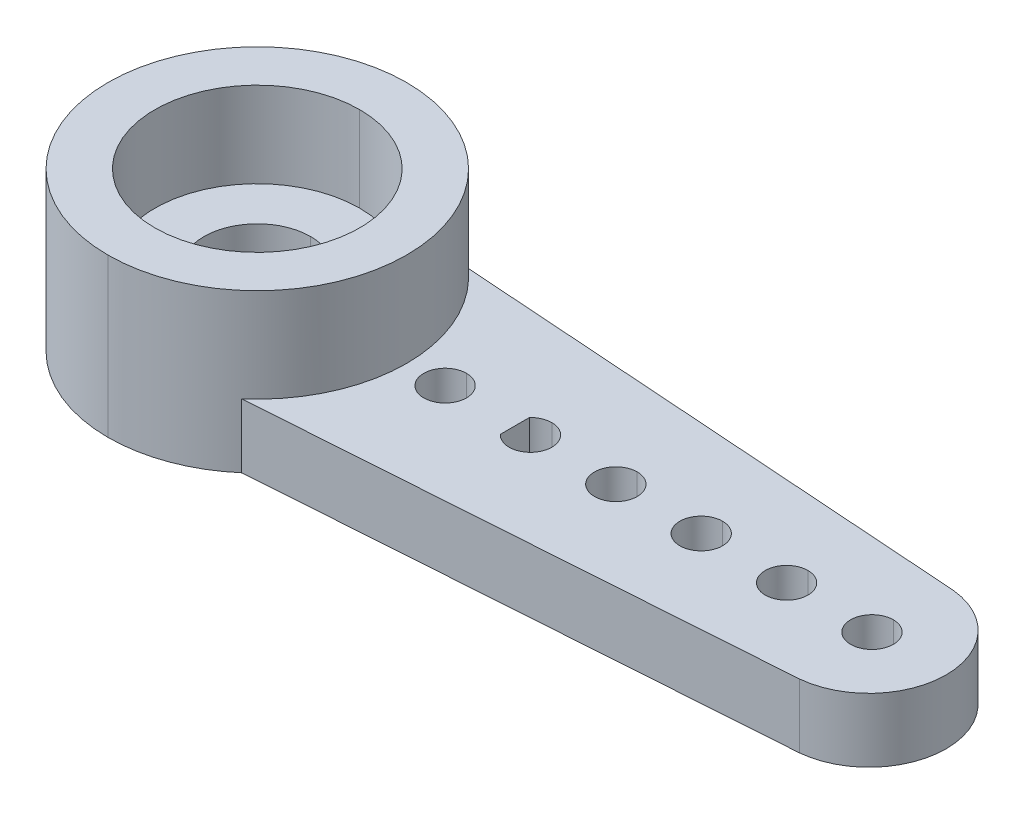
ISO-10303-21;
HEADER;
FILE_DESCRIPTION(('STEP AP214'),'2;1');
FILE_NAME('part.step','',(''),(''),'','','');
FILE_SCHEMA(('AUTOMOTIVE_DESIGN { 1 0 10303 214 1 1 1 1 }'));
ENDSEC;
DATA;
#1=APPLICATION_CONTEXT('core data for automotive mechanical design processes');
#2=APPLICATION_PROTOCOL_DEFINITION('international standard','automotive_design',2000,#1);
#3=PRODUCT_CONTEXT('',#1,'mechanical');
#4=PRODUCT('Part','Part','',(#3));
#5=PRODUCT_RELATED_PRODUCT_CATEGORY('part','',(#4));
#6=PRODUCT_DEFINITION_FORMATION('','',#4);
#7=PRODUCT_DEFINITION_CONTEXT('part definition',#1,'design');
#8=PRODUCT_DEFINITION('design','',#6,#7);
#9=PRODUCT_DEFINITION_SHAPE('','',#8);
#10=(LENGTH_UNIT() NAMED_UNIT(*) SI_UNIT(.MILLI.,.METRE.));
#11=(NAMED_UNIT(*) PLANE_ANGLE_UNIT() SI_UNIT($,.RADIAN.));
#12=(NAMED_UNIT(*) SI_UNIT($,.STERADIAN.) SOLID_ANGLE_UNIT());
#13=UNCERTAINTY_MEASURE_WITH_UNIT(LENGTH_MEASURE(1.E-05),#10,'distance_accuracy_value','');
#14=(GEOMETRIC_REPRESENTATION_CONTEXT(3) GLOBAL_UNCERTAINTY_ASSIGNED_CONTEXT((#13)) GLOBAL_UNIT_ASSIGNED_CONTEXT((#10,
#11,#12)) REPRESENTATION_CONTEXT('',''));
#15=CARTESIAN_POINT('',(0.,0.,0.));
#16=DIRECTION('',(0.,0.,1.));
#17=DIRECTION('',(1.,0.,0.));
#18=AXIS2_PLACEMENT_3D('',#15,#16,#17);
#19=CARTESIAN_POINT('',(6.4,3.7,0.));
#20=DIRECTION('',(0.,-1.,0.));
#21=DIRECTION('',(0.,0.,-1.));
#22=AXIS2_PLACEMENT_3D('',#19,#20,#21);
#23=CYLINDRICAL_SURFACE('',#22,0.5);
#24=DIRECTION('',(0.,-1.,0.));
#25=VECTOR('',#24,1.);
#26=CARTESIAN_POINT('',(6.03428434471898,3.7,-0.34095756258276));
#27=LINE('',#26,#25);
#28=CARTESIAN_POINT('',(6.03428434471898,0.,-0.34095756258276));
#29=VERTEX_POINT('',#28);
#30=CARTESIAN_POINT('',(6.03428434471898,1.5,-0.34095756258276));
#31=VERTEX_POINT('',#30);
#32=EDGE_CURVE('E494',#29,#31,#27,.F.);
#33=ORIENTED_EDGE('',*,*,#32,.F.);
#34=CARTESIAN_POINT('',(6.4,0.,0.));
#35=DIRECTION('',(0.,-1.,0.));
#36=DIRECTION('',(0.,0.,-1.));
#37=AXIS2_PLACEMENT_3D('',#34,#35,#36);
#38=CIRCLE('',#37,0.5);
#39=CARTESIAN_POINT('',(6.4,0.,-0.5));
#40=VERTEX_POINT('',#39);
#41=EDGE_CURVE('E321',#29,#40,#38,.T.);
#42=ORIENTED_EDGE('',*,*,#41,.T.);
#43=DIRECTION('',(0.,-1.,0.));
#44=VECTOR('',#43,1.);
#45=CARTESIAN_POINT('',(6.4,3.7,-0.5));
#46=LINE('',#45,#44);
#47=CARTESIAN_POINT('',(6.4,1.5,-0.5));
#48=VERTEX_POINT('',#47);
#49=EDGE_CURVE('E412',#48,#40,#46,.T.);
#50=ORIENTED_EDGE('',*,*,#49,.F.);
#51=CARTESIAN_POINT('',(6.4,1.5,0.));
#52=DIRECTION('',(0.,-1.,0.));
#53=DIRECTION('',(0.,0.,-1.));
#54=AXIS2_PLACEMENT_3D('',#51,#52,#53);
#55=CIRCLE('',#54,0.5);
#56=EDGE_CURVE('E300',#31,#48,#55,.T.);
#57=ORIENTED_EDGE('',*,*,#56,.F.);
#58=EDGE_LOOP('',(#33,#42,#50,#57));
#59=FACE_BOUND('',#58,.T.);
#60=ADVANCED_FACE('F36',(#59),#23,.F.);
#61=DIRECTION('',(0.,-1.,0.));
#62=VECTOR('',#61,1.);
#63=CARTESIAN_POINT('',(6.03428434471898,3.7,0.34095756258276));
#64=LINE('',#63,#62);
#65=CARTESIAN_POINT('',(6.03428434471898,1.5,0.34095756258276));
#66=VERTEX_POINT('',#65);
#67=CARTESIAN_POINT('',(6.03428434471898,0.,0.340957562582761));
#68=VERTEX_POINT('',#67);
#69=EDGE_CURVE('E560',#66,#68,#64,.T.);
#70=ORIENTED_EDGE('',*,*,#69,.F.);
#71=CARTESIAN_POINT('',(6.4,1.5,0.5));
#72=VERTEX_POINT('',#71);
#73=EDGE_CURVE('E351',#72,#66,#55,.T.);
#74=ORIENTED_EDGE('',*,*,#73,.F.);
#75=DIRECTION('',(0.,-1.,0.));
#76=VECTOR('',#75,1.);
#77=CARTESIAN_POINT('',(6.4,3.7,0.5));
#78=LINE('',#77,#76);
#79=CARTESIAN_POINT('',(6.4,0.,0.5));
#80=VERTEX_POINT('',#79);
#81=EDGE_CURVE('E320',#72,#80,#78,.T.);
#82=ORIENTED_EDGE('',*,*,#81,.T.);
#83=EDGE_CURVE('E316',#80,#68,#38,.T.);
#84=ORIENTED_EDGE('',*,*,#83,.T.);
#85=EDGE_LOOP('',(#70,#74,#82,#84));
#86=FACE_BOUND('',#85,.T.);
#87=ADVANCED_FACE('F558',(#86),#23,.F.);
#88=CARTESIAN_POINT('',(0.,3.7,0.));
#89=DIRECTION('',(0.,-1.,0.));
#90=DIRECTION('',(0.,0.,-1.));
#91=AXIS2_PLACEMENT_3D('',#88,#89,#90);
#92=CYLINDRICAL_SURFACE('',#91,3.5);
#93=CARTESIAN_POINT('',(0.,3.7,0.));
#94=DIRECTION('',(0.,-1.,0.));
#95=DIRECTION('',(0.,0.,-1.));
#96=AXIS2_PLACEMENT_3D('',#93,#94,#95);
#97=CIRCLE('',#96,3.5);
#98=CARTESIAN_POINT('',(0.,3.7,-3.5));
#99=VERTEX_POINT('',#98);
#100=CARTESIAN_POINT('',(0.,3.7,3.5));
#101=VERTEX_POINT('',#100);
#102=EDGE_CURVE('E11',#99,#101,#97,.T.);
#103=ORIENTED_EDGE('',*,*,#102,.T.);
#104=DIRECTION('',(0.,-1.,0.));
#105=VECTOR('',#104,1.);
#106=CARTESIAN_POINT('',(0.,3.7,3.5));
#107=LINE('',#106,#105);
#108=CARTESIAN_POINT('',(0.,0.,3.5));
#109=VERTEX_POINT('',#108);
#110=EDGE_CURVE('E46',#101,#109,#107,.T.);
#111=ORIENTED_EDGE('',*,*,#110,.T.);
#112=CARTESIAN_POINT('',(0.,0.,0.));
#113=DIRECTION('',(0.,1.,0.));
#114=DIRECTION('',(0.,0.,-1.));
#115=AXIS2_PLACEMENT_3D('',#112,#113,#114);
#116=CIRCLE('',#115,3.5);
#117=CARTESIAN_POINT('',(2.286,0.,2.65032148993287));
#118=VERTEX_POINT('',#117);
#119=EDGE_CURVE('E257',#109,#118,#116,.T.);
#120=ORIENTED_EDGE('',*,*,#119,.T.);
#121=DIRECTION('',(0.,1.,0.));
#122=VECTOR('',#121,1.);
#123=CARTESIAN_POINT('',(2.286,3.7,2.65032148993287));
#124=LINE('',#123,#122);
#125=CARTESIAN_POINT('',(2.286,1.5,2.65032148993287));
#126=VERTEX_POINT('',#125);
#127=EDGE_CURVE('E245',#118,#126,#124,.T.);
#128=ORIENTED_EDGE('',*,*,#127,.T.);
#129=CARTESIAN_POINT('',(0.,1.5,0.));
#130=DIRECTION('',(0.,1.,0.));
#131=DIRECTION('',(0.,0.,-1.));
#132=AXIS2_PLACEMENT_3D('',#129,#130,#131);
#133=CIRCLE('',#132,3.5);
#134=CARTESIAN_POINT('',(2.286,1.5,-2.65032148993287));
#135=VERTEX_POINT('',#134);
#136=EDGE_CURVE('E258',#126,#135,#133,.T.);
#137=ORIENTED_EDGE('',*,*,#136,.T.);
#138=DIRECTION('',(0.,-1.,0.));
#139=VECTOR('',#138,1.);
#140=CARTESIAN_POINT('',(2.286,3.7,-2.65032148993287));
#141=LINE('',#140,#139);
#142=CARTESIAN_POINT('',(2.286,0.,-2.65032148993287));
#143=VERTEX_POINT('',#142);
#144=EDGE_CURVE('E369',#135,#143,#141,.T.);
#145=ORIENTED_EDGE('',*,*,#144,.T.);
#146=CARTESIAN_POINT('',(0.,0.,0.));
#147=DIRECTION('',(0.,1.,0.));
#148=DIRECTION('',(0.,0.,-1.));
#149=AXIS2_PLACEMENT_3D('',#146,#147,#148);
#150=CIRCLE('',#149,3.5);
#151=CARTESIAN_POINT('',(0.,0.,-3.5));
#152=VERTEX_POINT('',#151);
#153=EDGE_CURVE('E283',#143,#152,#150,.T.);
#154=ORIENTED_EDGE('',*,*,#153,.T.);
#155=DIRECTION('',(0.,-1.,0.));
#156=VECTOR('',#155,1.);
#157=CARTESIAN_POINT('',(0.,3.7,-3.5));
#158=LINE('',#157,#156);
#159=EDGE_CURVE('E470',#99,#152,#158,.T.);
#160=ORIENTED_EDGE('',*,*,#159,.F.);
#161=EDGE_LOOP('',(#103,#111,#120,#128,#137,#145,#154,#160));
#162=FACE_BOUND('',#161,.T.);
#163=ADVANCED_FACE('F260',(#162),#92,.T.);
#164=CARTESIAN_POINT('',(0.,1.,0.));
#165=DIRECTION('',(0.,-1.,0.));
#166=DIRECTION('',(0.,0.,-1.));
#167=AXIS2_PLACEMENT_3D('',#164,#165,#166);
#168=CYLINDRICAL_SURFACE('',#167,2.4);
#169=CARTESIAN_POINT('',(0.,1.,0.));
#170=DIRECTION('',(0.,-1.,0.));
#171=DIRECTION('',(0.,0.,-1.));
#172=AXIS2_PLACEMENT_3D('',#169,#170,#171);
#173=CIRCLE('',#172,2.4);
#174=CARTESIAN_POINT('',(0.,1.,2.4));
#175=VERTEX_POINT('',#174);
#176=CARTESIAN_POINT('',(0.,1.,-2.4));
#177=VERTEX_POINT('',#176);
#178=EDGE_CURVE('E306',#175,#177,#173,.T.);
#179=ORIENTED_EDGE('',*,*,#178,.F.);
#180=DIRECTION('',(0.,-1.,0.));
#181=VECTOR('',#180,1.);
#182=CARTESIAN_POINT('',(0.,1.,2.4));
#183=LINE('',#182,#181);
#184=CARTESIAN_POINT('',(0.,0.,2.4));
#185=VERTEX_POINT('',#184);
#186=EDGE_CURVE('E311',#175,#185,#183,.T.);
#187=ORIENTED_EDGE('',*,*,#186,.T.);
#188=CARTESIAN_POINT('',(0.,0.,0.));
#189=DIRECTION('',(0.,-1.,0.));
#190=DIRECTION('',(0.,0.,-1.));
#191=AXIS2_PLACEMENT_3D('',#188,#189,#190);
#192=CIRCLE('',#191,2.4);
#193=CARTESIAN_POINT('',(0.,0.,-2.4));
#194=VERTEX_POINT('',#193);
#195=EDGE_CURVE('E315',#185,#194,#192,.T.);
#196=ORIENTED_EDGE('',*,*,#195,.T.);
#197=DIRECTION('',(0.,-1.,0.));
#198=VECTOR('',#197,1.);
#199=CARTESIAN_POINT('',(0.,1.,-2.4));
#200=LINE('',#199,#198);
#201=EDGE_CURVE('E271',#177,#194,#200,.T.);
#202=ORIENTED_EDGE('',*,*,#201,.F.);
#203=EDGE_LOOP('',(#179,#187,#196,#202));
#204=FACE_BOUND('',#203,.T.);
#205=ADVANCED_FACE('F591',(#204),#168,.F.);
#206=CARTESIAN_POINT('',(14.4,3.7,0.));
#207=DIRECTION('',(0.,-1.,0.));
#208=DIRECTION('',(0.,0.,-1.));
#209=AXIS2_PLACEMENT_3D('',#206,#207,#208);
#210=CYLINDRICAL_SURFACE('',#209,0.5);
#211=CARTESIAN_POINT('',(14.4,1.5,0.));
#212=DIRECTION('',(0.,-1.,0.));
#213=DIRECTION('',(0.,0.,-1.));
#214=AXIS2_PLACEMENT_3D('',#211,#212,#213);
#215=CIRCLE('',#214,0.5);
#216=CARTESIAN_POINT('',(14.4,1.5,0.5));
#217=VERTEX_POINT('',#216);
#218=CARTESIAN_POINT('',(14.4,1.5,-0.5));
#219=VERTEX_POINT('',#218);
#220=EDGE_CURVE('E380',#217,#219,#215,.T.);
#221=ORIENTED_EDGE('',*,*,#220,.F.);
#222=DIRECTION('',(0.,-1.,0.));
#223=VECTOR('',#222,1.);
#224=CARTESIAN_POINT('',(14.4,3.7,0.5));
#225=LINE('',#224,#223);
#226=CARTESIAN_POINT('',(14.4,0.,0.5));
#227=VERTEX_POINT('',#226);
#228=EDGE_CURVE('E326',#217,#227,#225,.T.);
#229=ORIENTED_EDGE('',*,*,#228,.T.);
#230=CARTESIAN_POINT('',(14.4,0.,0.));
#231=DIRECTION('',(0.,-1.,0.));
#232=DIRECTION('',(0.,0.,-1.));
#233=AXIS2_PLACEMENT_3D('',#230,#231,#232);
#234=CIRCLE('',#233,0.5);
#235=CARTESIAN_POINT('',(14.4,0.,-0.5));
#236=VERTEX_POINT('',#235);
#237=EDGE_CURVE('E330',#227,#236,#234,.T.);
#238=ORIENTED_EDGE('',*,*,#237,.T.);
#239=DIRECTION('',(0.,-1.,0.));
#240=VECTOR('',#239,1.);
#241=CARTESIAN_POINT('',(14.4,3.7,-0.5));
#242=LINE('',#241,#240);
#243=EDGE_CURVE('E362',#219,#236,#242,.T.);
#244=ORIENTED_EDGE('',*,*,#243,.F.);
#245=EDGE_LOOP('',(#221,#229,#238,#244));
#246=FACE_BOUND('',#245,.T.);
#247=ADVANCED_FACE('F645',(#246),#210,.F.);
#248=CARTESIAN_POINT('',(12.4,3.7,0.));
#249=DIRECTION('',(0.,-1.,0.));
#250=DIRECTION('',(0.,0.,-1.));
#251=AXIS2_PLACEMENT_3D('',#248,#249,#250);
#252=CYLINDRICAL_SURFACE('',#251,0.5);
#253=CARTESIAN_POINT('',(12.4,1.5,0.));
#254=DIRECTION('',(0.,-1.,0.));
#255=DIRECTION('',(0.,0.,-1.));
#256=AXIS2_PLACEMENT_3D('',#253,#254,#255);
#257=CIRCLE('',#256,0.5);
#258=CARTESIAN_POINT('',(12.4,1.5,0.5));
#259=VERTEX_POINT('',#258);
#260=CARTESIAN_POINT('',(12.4,1.5,-0.5));
#261=VERTEX_POINT('',#260);
#262=EDGE_CURVE('E381',#259,#261,#257,.T.);
#263=ORIENTED_EDGE('',*,*,#262,.F.);
#264=DIRECTION('',(0.,-1.,0.));
#265=VECTOR('',#264,1.);
#266=CARTESIAN_POINT('',(12.4,3.7,0.5));
#267=LINE('',#266,#265);
#268=CARTESIAN_POINT('',(12.4,0.,0.5));
#269=VERTEX_POINT('',#268);
#270=EDGE_CURVE('E334',#259,#269,#267,.T.);
#271=ORIENTED_EDGE('',*,*,#270,.T.);
#272=CARTESIAN_POINT('',(12.4,0.,0.));
#273=DIRECTION('',(0.,-1.,0.));
#274=DIRECTION('',(0.,0.,-1.));
#275=AXIS2_PLACEMENT_3D('',#272,#273,#274);
#276=CIRCLE('',#275,0.5);
#277=CARTESIAN_POINT('',(12.4,0.,-0.5));
#278=VERTEX_POINT('',#277);
#279=EDGE_CURVE('E331',#269,#278,#276,.T.);
#280=ORIENTED_EDGE('',*,*,#279,.T.);
#281=DIRECTION('',(0.,-1.,0.));
#282=VECTOR('',#281,1.);
#283=CARTESIAN_POINT('',(12.4,3.7,-0.5));
#284=LINE('',#283,#282);
#285=EDGE_CURVE('E40',#261,#278,#284,.T.);
#286=ORIENTED_EDGE('',*,*,#285,.F.);
#287=EDGE_LOOP('',(#263,#271,#280,#286));
#288=FACE_BOUND('',#287,.T.);
#289=ADVANCED_FACE('F640',(#288),#252,.F.);
#290=CARTESIAN_POINT('',(10.4,3.7,0.));
#291=DIRECTION('',(0.,-1.,0.));
#292=DIRECTION('',(0.,0.,-1.));
#293=AXIS2_PLACEMENT_3D('',#290,#291,#292);
#294=CYLINDRICAL_SURFACE('',#293,0.5);
#295=CARTESIAN_POINT('',(10.4,1.5,0.));
#296=DIRECTION('',(0.,-1.,0.));
#297=DIRECTION('',(0.,0.,-1.));
#298=AXIS2_PLACEMENT_3D('',#295,#296,#297);
#299=CIRCLE('',#298,0.5);
#300=CARTESIAN_POINT('',(10.4,1.5,0.5));
#301=VERTEX_POINT('',#300);
#302=CARTESIAN_POINT('',(10.4,1.5,-0.5));
#303=VERTEX_POINT('',#302);
#304=EDGE_CURVE('E347',#301,#303,#299,.T.);
#305=ORIENTED_EDGE('',*,*,#304,.F.);
#306=DIRECTION('',(0.,-1.,0.));
#307=VECTOR('',#306,1.);
#308=CARTESIAN_POINT('',(10.4,3.7,0.5));
#309=LINE('',#308,#307);
#310=CARTESIAN_POINT('',(10.4,0.,0.5));
#311=VERTEX_POINT('',#310);
#312=EDGE_CURVE('E335',#301,#311,#309,.T.);
#313=ORIENTED_EDGE('',*,*,#312,.T.);
#314=CARTESIAN_POINT('',(10.4,0.,0.));
#315=DIRECTION('',(0.,-1.,0.));
#316=DIRECTION('',(0.,0.,-1.));
#317=AXIS2_PLACEMENT_3D('',#314,#315,#316);
#318=CIRCLE('',#317,0.5);
#319=CARTESIAN_POINT('',(10.4,0.,-0.5));
#320=VERTEX_POINT('',#319);
#321=EDGE_CURVE('E448',#311,#320,#318,.T.);
#322=ORIENTED_EDGE('',*,*,#321,.T.);
#323=DIRECTION('',(0.,-1.,0.));
#324=VECTOR('',#323,1.);
#325=CARTESIAN_POINT('',(10.4,3.7,-0.5));
#326=LINE('',#325,#324);
#327=EDGE_CURVE('E421',#303,#320,#326,.T.);
#328=ORIENTED_EDGE('',*,*,#327,.F.);
#329=EDGE_LOOP('',(#305,#313,#322,#328));
#330=FACE_BOUND('',#329,.T.);
#331=ADVANCED_FACE('F518',(#330),#294,.F.);
#332=CARTESIAN_POINT('',(8.4,3.7,0.));
#333=DIRECTION('',(0.,-1.,0.));
#334=DIRECTION('',(0.,0.,-1.));
#335=AXIS2_PLACEMENT_3D('',#332,#333,#334);
#336=CYLINDRICAL_SURFACE('',#335,0.5);
#337=CARTESIAN_POINT('',(8.4,1.5,0.));
#338=DIRECTION('',(0.,-1.,0.));
#339=DIRECTION('',(0.,0.,-1.));
#340=AXIS2_PLACEMENT_3D('',#337,#338,#339);
#341=CIRCLE('',#340,0.5);
#342=CARTESIAN_POINT('',(8.4,1.5,0.5));
#343=VERTEX_POINT('',#342);
#344=CARTESIAN_POINT('',(8.4,1.5,-0.5));
#345=VERTEX_POINT('',#344);
#346=EDGE_CURVE('E336',#343,#345,#341,.T.);
#347=ORIENTED_EDGE('',*,*,#346,.F.);
#348=DIRECTION('',(0.,-1.,0.));
#349=VECTOR('',#348,1.);
#350=CARTESIAN_POINT('',(8.4,3.7,0.5));
#351=LINE('',#350,#349);
#352=CARTESIAN_POINT('',(8.4,0.,0.5));
#353=VERTEX_POINT('',#352);
#354=EDGE_CURVE('E477',#343,#353,#351,.T.);
#355=ORIENTED_EDGE('',*,*,#354,.T.);
#356=CARTESIAN_POINT('',(8.4,0.,0.));
#357=DIRECTION('',(0.,-1.,0.));
#358=DIRECTION('',(0.,0.,-1.));
#359=AXIS2_PLACEMENT_3D('',#356,#357,#358);
#360=CIRCLE('',#359,0.5);
#361=CARTESIAN_POINT('',(8.4,0.,-0.5));
#362=VERTEX_POINT('',#361);
#363=EDGE_CURVE('E434',#353,#362,#360,.T.);
#364=ORIENTED_EDGE('',*,*,#363,.T.);
#365=DIRECTION('',(0.,-1.,0.));
#366=VECTOR('',#365,1.);
#367=CARTESIAN_POINT('',(8.4,3.7,-0.5));
#368=LINE('',#367,#366);
#369=EDGE_CURVE('E422',#345,#362,#368,.T.);
#370=ORIENTED_EDGE('',*,*,#369,.F.);
#371=EDGE_LOOP('',(#347,#355,#364,#370));
#372=FACE_BOUND('',#371,.T.);
#373=ADVANCED_FACE('F631',(#372),#336,.F.);
#374=CARTESIAN_POINT('',(4.4,3.7,0.));
#375=DIRECTION('',(0.,-1.,0.));
#376=DIRECTION('',(0.,0.,-1.));
#377=AXIS2_PLACEMENT_3D('',#374,#375,#376);
#378=CYLINDRICAL_SURFACE('',#377,0.5);
#379=CARTESIAN_POINT('',(4.4,1.5,0.));
#380=DIRECTION('',(0.,-1.,0.));
#381=DIRECTION('',(0.,0.,-1.));
#382=AXIS2_PLACEMENT_3D('',#379,#380,#381);
#383=CIRCLE('',#382,0.5);
#384=CARTESIAN_POINT('',(4.4,1.5,0.5));
#385=VERTEX_POINT('',#384);
#386=CARTESIAN_POINT('',(4.4,1.5,-0.5));
#387=VERTEX_POINT('',#386);
#388=EDGE_CURVE('E301',#385,#387,#383,.T.);
#389=ORIENTED_EDGE('',*,*,#388,.F.);
#390=DIRECTION('',(0.,-1.,0.));
#391=VECTOR('',#390,1.);
#392=CARTESIAN_POINT('',(4.4,3.7,0.5));
#393=LINE('',#392,#391);
#394=CARTESIAN_POINT('',(4.4,0.,0.5));
#395=VERTEX_POINT('',#394);
#396=EDGE_CURVE('E288',#385,#395,#393,.T.);
#397=ORIENTED_EDGE('',*,*,#396,.T.);
#398=CARTESIAN_POINT('',(4.4,0.,0.));
#399=DIRECTION('',(0.,-1.,0.));
#400=DIRECTION('',(0.,0.,-1.));
#401=AXIS2_PLACEMENT_3D('',#398,#399,#400);
#402=CIRCLE('',#401,0.5);
#403=CARTESIAN_POINT('',(4.4,0.,-0.5));
#404=VERTEX_POINT('',#403);
#405=EDGE_CURVE('E285',#395,#404,#402,.T.);
#406=ORIENTED_EDGE('',*,*,#405,.T.);
#407=DIRECTION('',(0.,-1.,0.));
#408=VECTOR('',#407,1.);
#409=CARTESIAN_POINT('',(4.4,3.7,-0.5));
#410=LINE('',#409,#408);
#411=EDGE_CURVE('E398',#387,#404,#410,.T.);
#412=ORIENTED_EDGE('',*,*,#411,.F.);
#413=EDGE_LOOP('',(#389,#397,#406,#412));
#414=FACE_BOUND('',#413,.T.);
#415=ADVANCED_FACE('F634',(#414),#378,.F.);
#416=CARTESIAN_POINT('',(0.,1.7,0.));
#417=DIRECTION('',(0.,1.,0.));
#418=DIRECTION('',(0.,0.,1.));
#419=AXIS2_PLACEMENT_3D('',#416,#417,#418);
#420=CYLINDRICAL_SURFACE('',#419,2.4);
#421=CARTESIAN_POINT('',(0.,1.7,0.));
#422=DIRECTION('',(0.,1.,0.));
#423=DIRECTION('',(0.,0.,1.));
#424=AXIS2_PLACEMENT_3D('',#421,#422,#423);
#425=CIRCLE('',#424,2.4);
#426=CARTESIAN_POINT('',(0.,1.7,-2.4));
#427=VERTEX_POINT('',#426);
#428=CARTESIAN_POINT('',(0.,1.7,2.4));
#429=VERTEX_POINT('',#428);
#430=EDGE_CURVE('E397',#427,#429,#425,.T.);
#431=ORIENTED_EDGE('',*,*,#430,.F.);
#432=DIRECTION('',(0.,1.,0.));
#433=VECTOR('',#432,1.);
#434=CARTESIAN_POINT('',(0.,1.7,-2.4));
#435=LINE('',#434,#433);
#436=CARTESIAN_POINT('',(0.,3.7,-2.4));
#437=VERTEX_POINT('',#436);
#438=EDGE_CURVE('E289',#427,#437,#435,.T.);
#439=ORIENTED_EDGE('',*,*,#438,.T.);
#440=CARTESIAN_POINT('',(0.,3.7,0.));
#441=DIRECTION('',(0.,-1.,0.));
#442=DIRECTION('',(0.,0.,1.));
#443=AXIS2_PLACEMENT_3D('',#440,#441,#442);
#444=CIRCLE('',#443,2.4);
#445=CARTESIAN_POINT('',(0.,3.7,2.4));
#446=VERTEX_POINT('',#445);
#447=EDGE_CURVE('E365',#446,#437,#444,.T.);
#448=ORIENTED_EDGE('',*,*,#447,.F.);
#449=DIRECTION('',(0.,1.,0.));
#450=VECTOR('',#449,1.);
#451=CARTESIAN_POINT('',(0.,1.7,2.4));
#452=LINE('',#451,#450);
#453=EDGE_CURVE('E462',#429,#446,#452,.T.);
#454=ORIENTED_EDGE('',*,*,#453,.F.);
#455=EDGE_LOOP('',(#431,#439,#448,#454));
#456=FACE_BOUND('',#455,.T.);
#457=ADVANCED_FACE('F606',(#456),#420,.F.);
#458=CARTESIAN_POINT('',(0.,3.7,0.));
#459=DIRECTION('',(0.,-1.,0.));
#460=DIRECTION('',(0.,0.,-1.));
#461=AXIS2_PLACEMENT_3D('',#458,#459,#460);
#462=CYLINDRICAL_SURFACE('',#461,1.25);
#463=CARTESIAN_POINT('',(0.,1.7,0.));
#464=DIRECTION('',(0.,-1.,0.));
#465=DIRECTION('',(0.,0.,-1.));
#466=AXIS2_PLACEMENT_3D('',#463,#464,#465);
#467=CIRCLE('',#466,1.25);
#468=CARTESIAN_POINT('',(0.,1.7,1.25));
#469=VERTEX_POINT('',#468);
#470=CARTESIAN_POINT('',(0.,1.7,-1.25));
#471=VERTEX_POINT('',#470);
#472=EDGE_CURVE('E128',#469,#471,#467,.T.);
#473=ORIENTED_EDGE('',*,*,#472,.F.);
#474=DIRECTION('',(0.,-1.,0.));
#475=VECTOR('',#474,1.);
#476=CARTESIAN_POINT('',(0.,3.7,1.25));
#477=LINE('',#476,#475);
#478=CARTESIAN_POINT('',(0.,1.,1.25));
#479=VERTEX_POINT('',#478);
#480=EDGE_CURVE('E302',#469,#479,#477,.T.);
#481=ORIENTED_EDGE('',*,*,#480,.T.);
#482=CARTESIAN_POINT('',(0.,1.,0.));
#483=DIRECTION('',(0.,1.,0.));
#484=DIRECTION('',(0.,0.,-1.));
#485=AXIS2_PLACEMENT_3D('',#482,#483,#484);
#486=CIRCLE('',#485,1.25);
#487=CARTESIAN_POINT('',(0.,1.,-1.25));
#488=VERTEX_POINT('',#487);
#489=EDGE_CURVE('E143',#488,#479,#486,.T.);
#490=ORIENTED_EDGE('',*,*,#489,.F.);
#491=DIRECTION('',(0.,-1.,0.));
#492=VECTOR('',#491,1.);
#493=CARTESIAN_POINT('',(0.,3.7,-1.25));
#494=LINE('',#493,#492);
#495=EDGE_CURVE('E396',#471,#488,#494,.T.);
#496=ORIENTED_EDGE('',*,*,#495,.F.);
#497=EDGE_LOOP('',(#473,#481,#490,#496));
#498=FACE_BOUND('',#497,.T.);
#499=ADVANCED_FACE('F598',(#498),#462,.F.);
#500=CARTESIAN_POINT('',(0.,0.,0.));
#501=DIRECTION('',(0.,1.,0.));
#502=DIRECTION('',(1.,0.,0.));
#503=AXIS2_PLACEMENT_3D('',#500,#501,#502);
#504=PLANE('',#503);
#505=ORIENTED_EDGE('',*,*,#41,.F.);
#506=DIRECTION('',(0.,0.,-1.));
#507=VECTOR('',#506,1.);
#508=CARTESIAN_POINT('',(6.03428434471898,0.,4.10770728844889));
#509=LINE('',#508,#507);
#510=EDGE_CURVE('E555',#68,#29,#509,.T.);
#511=ORIENTED_EDGE('',*,*,#510,.F.);
#512=ORIENTED_EDGE('',*,*,#83,.F.);
#513=CARTESIAN_POINT('',(6.4,0.,0.));
#514=DIRECTION('',(0.,-1.,0.));
#515=DIRECTION('',(0.,0.,-1.));
#516=AXIS2_PLACEMENT_3D('',#513,#514,#515);
#517=CIRCLE('',#516,0.5);
#518=EDGE_CURVE('E401',#40,#80,#517,.T.);
#519=ORIENTED_EDGE('',*,*,#518,.F.);
#520=EDGE_LOOP('',(#505,#511,#512,#519));
#521=FACE_BOUND('',#520,.T.);
#522=CARTESIAN_POINT('',(14.3294319151538,0.,0.));
#523=DIRECTION('',(0.,1.,0.));
#524=DIRECTION('',(0.,0.,-1.));
#525=AXIS2_PLACEMENT_3D('',#522,#523,#524);
#526=CIRCLE('',#525,1.8083256925511);
#527=CARTESIAN_POINT('',(14.5027576499436,0.,1.8));
#528=VERTEX_POINT('',#527);
#529=CARTESIAN_POINT('',(14.5027576499436,0.,-1.8));
#530=VERTEX_POINT('',#529);
#531=EDGE_CURVE('E268',#528,#530,#526,.T.);
#532=ORIENTED_EDGE('',*,*,#531,.F.);
#533=DIRECTION('',(0.99758648548161,0.,-0.0694348902530237));
#534=VECTOR('',#533,1.);
#535=CARTESIAN_POINT('',(2.286,0.,2.65032148993287));
#536=LINE('',#535,#534);
#537=EDGE_CURVE('E249',#118,#528,#536,.T.);
#538=ORIENTED_EDGE('',*,*,#537,.F.);
#539=ORIENTED_EDGE('',*,*,#119,.F.);
#540=CARTESIAN_POINT('',(0.,0.,0.));
#541=DIRECTION('',(0.,1.,0.));
#542=DIRECTION('',(0.,0.,-1.));
#543=AXIS2_PLACEMENT_3D('',#540,#541,#542);
#544=CIRCLE('',#543,3.5);
#545=EDGE_CURVE('E294',#152,#109,#544,.T.);
#546=ORIENTED_EDGE('',*,*,#545,.F.);
#547=ORIENTED_EDGE('',*,*,#153,.F.);
#548=DIRECTION('',(-0.99758648548161,0.,-0.0694348902530237));
#549=VECTOR('',#548,1.);
#550=CARTESIAN_POINT('',(14.5027576499436,0.,-1.8));
#551=LINE('',#550,#549);
#552=EDGE_CURVE('E295',#530,#143,#551,.T.);
#553=ORIENTED_EDGE('',*,*,#552,.F.);
#554=EDGE_LOOP('',(#532,#538,#539,#546,#547,#553));
#555=FACE_BOUND('',#554,.T.);
#556=CARTESIAN_POINT('',(4.4,0.,0.));
#557=DIRECTION('',(0.,-1.,0.));
#558=DIRECTION('',(0.,0.,-1.));
#559=AXIS2_PLACEMENT_3D('',#556,#557,#558);
#560=CIRCLE('',#559,0.5);
#561=EDGE_CURVE('E402',#404,#395,#560,.T.);
#562=ORIENTED_EDGE('',*,*,#561,.F.);
#563=ORIENTED_EDGE('',*,*,#405,.F.);
#564=EDGE_LOOP('',(#562,#563));
#565=FACE_BOUND('',#564,.T.);
#566=CARTESIAN_POINT('',(8.4,0.,0.));
#567=DIRECTION('',(0.,-1.,0.));
#568=DIRECTION('',(0.,0.,-1.));
#569=AXIS2_PLACEMENT_3D('',#566,#567,#568);
#570=CIRCLE('',#569,0.5);
#571=EDGE_CURVE('E416',#362,#353,#570,.T.);
#572=ORIENTED_EDGE('',*,*,#571,.F.);
#573=ORIENTED_EDGE('',*,*,#363,.F.);
#574=EDGE_LOOP('',(#572,#573));
#575=FACE_BOUND('',#574,.T.);
#576=CARTESIAN_POINT('',(10.4,0.,0.));
#577=DIRECTION('',(0.,-1.,0.));
#578=DIRECTION('',(0.,0.,-1.));
#579=AXIS2_PLACEMENT_3D('',#576,#577,#578);
#580=CIRCLE('',#579,0.5);
#581=EDGE_CURVE('E417',#320,#311,#580,.T.);
#582=ORIENTED_EDGE('',*,*,#581,.F.);
#583=ORIENTED_EDGE('',*,*,#321,.F.);
#584=EDGE_LOOP('',(#582,#583));
#585=FACE_BOUND('',#584,.T.);
#586=CARTESIAN_POINT('',(12.4,0.,0.));
#587=DIRECTION('',(0.,-1.,0.));
#588=DIRECTION('',(0.,0.,-1.));
#589=AXIS2_PLACEMENT_3D('',#586,#587,#588);
#590=CIRCLE('',#589,0.5);
#591=EDGE_CURVE('E491',#278,#269,#590,.T.);
#592=ORIENTED_EDGE('',*,*,#591,.F.);
#593=ORIENTED_EDGE('',*,*,#279,.F.);
#594=EDGE_LOOP('',(#592,#593));
#595=FACE_BOUND('',#594,.T.);
#596=CARTESIAN_POINT('',(14.4,0.,0.));
#597=DIRECTION('',(0.,-1.,0.));
#598=DIRECTION('',(0.,0.,-1.));
#599=AXIS2_PLACEMENT_3D('',#596,#597,#598);
#600=CIRCLE('',#599,0.5);
#601=EDGE_CURVE('E363',#236,#227,#600,.T.);
#602=ORIENTED_EDGE('',*,*,#601,.F.);
#603=ORIENTED_EDGE('',*,*,#237,.F.);
#604=EDGE_LOOP('',(#602,#603));
#605=FACE_BOUND('',#604,.T.);
#606=CARTESIAN_POINT('',(0.,0.,0.));
#607=DIRECTION('',(0.,-1.,0.));
#608=DIRECTION('',(0.,0.,-1.));
#609=AXIS2_PLACEMENT_3D('',#606,#607,#608);
#610=CIRCLE('',#609,2.4);
#611=EDGE_CURVE('E279',#194,#185,#610,.T.);
#612=ORIENTED_EDGE('',*,*,#611,.F.);
#613=ORIENTED_EDGE('',*,*,#195,.F.);
#614=EDGE_LOOP('',(#612,#613));
#615=FACE_BOUND('',#614,.T.);
#616=ADVANCED_FACE('F265',(#521,#555,#565,#575,#585,#595,#605,#615),#504,.F.);
#617=CARTESIAN_POINT('',(0.,3.7,0.));
#618=DIRECTION('',(0.,-1.,0.));
#619=DIRECTION('',(0.,0.,-1.));
#620=AXIS2_PLACEMENT_3D('',#617,#618,#619);
#621=CYLINDRICAL_SURFACE('',#620,3.5);
#622=ORIENTED_EDGE('',*,*,#110,.F.);
#623=CARTESIAN_POINT('',(0.,3.7,0.));
#624=DIRECTION('',(0.,-1.,0.));
#625=DIRECTION('',(0.,0.,-1.));
#626=AXIS2_PLACEMENT_3D('',#623,#624,#625);
#627=CIRCLE('',#626,3.5);
#628=EDGE_CURVE('E305',#101,#99,#627,.T.);
#629=ORIENTED_EDGE('',*,*,#628,.T.);
#630=ORIENTED_EDGE('',*,*,#159,.T.);
#631=ORIENTED_EDGE('',*,*,#545,.T.);
#632=EDGE_LOOP('',(#622,#629,#630,#631));
#633=FACE_BOUND('',#632,.T.);
#634=ADVANCED_FACE('F597',(#633),#621,.T.);
#635=CARTESIAN_POINT('',(2.286,1.5,-2.65032148993287));
#636=DIRECTION('',(0.0694348902530237,0.,-0.99758648548161));
#637=DIRECTION('',(0.,-1.,0.));
#638=AXIS2_PLACEMENT_3D('',#635,#636,#637);
#639=PLANE('',#638);
#640=DIRECTION('',(0.,-1.,0.));
#641=VECTOR('',#640,1.);
#642=CARTESIAN_POINT('',(14.5027576499436,1.5,-1.8));
#643=LINE('',#642,#641);
#644=CARTESIAN_POINT('',(14.5027576499436,1.5,-1.8));
#645=VERTEX_POINT('',#644);
#646=EDGE_CURVE('E290',#645,#530,#643,.T.);
#647=ORIENTED_EDGE('',*,*,#646,.T.);
#648=ORIENTED_EDGE('',*,*,#552,.T.);
#649=ORIENTED_EDGE('',*,*,#144,.F.);
#650=DIRECTION('',(0.99758648548161,0.,0.0694348902530237));
#651=VECTOR('',#650,1.);
#652=CARTESIAN_POINT('',(2.286,1.5,-2.65032148993287));
#653=LINE('',#652,#651);
#654=EDGE_CURVE('E325',#135,#645,#653,.T.);
#655=ORIENTED_EDGE('',*,*,#654,.T.);
#656=EDGE_LOOP('',(#647,#648,#649,#655));
#657=FACE_BOUND('',#656,.T.);
#658=ADVANCED_FACE('F604',(#657),#639,.T.);
#659=CARTESIAN_POINT('',(14.3294319151538,1.5,0.));
#660=DIRECTION('',(0.,-1.,0.));
#661=DIRECTION('',(0.,0.,-1.));
#662=AXIS2_PLACEMENT_3D('',#659,#660,#661);
#663=CYLINDRICAL_SURFACE('',#662,1.8083256925511);
#664=CARTESIAN_POINT('',(14.3294319151538,1.5,0.));
#665=DIRECTION('',(0.,-1.,0.));
#666=DIRECTION('',(0.,0.,-1.));
#667=AXIS2_PLACEMENT_3D('',#664,#665,#666);
#668=CIRCLE('',#667,1.8083256925511);
#669=CARTESIAN_POINT('',(14.5027576499436,1.5,1.8));
#670=VERTEX_POINT('',#669);
#671=EDGE_CURVE('E382',#645,#670,#668,.T.);
#672=ORIENTED_EDGE('',*,*,#671,.T.);
#673=DIRECTION('',(0.,-1.,0.));
#674=VECTOR('',#673,1.);
#675=CARTESIAN_POINT('',(14.5027576499436,1.5,1.8));
#676=LINE('',#675,#674);
#677=EDGE_CURVE('E386',#670,#528,#676,.T.);
#678=ORIENTED_EDGE('',*,*,#677,.T.);
#679=ORIENTED_EDGE('',*,*,#531,.T.);
#680=ORIENTED_EDGE('',*,*,#646,.F.);
#681=EDGE_LOOP('',(#672,#678,#679,#680));
#682=FACE_BOUND('',#681,.T.);
#683=ADVANCED_FACE('F618',(#682),#663,.T.);
#684=CARTESIAN_POINT('',(2.286,1.5,2.65032148993287));
#685=DIRECTION('',(0.0694348902530237,0.,0.99758648548161));
#686=DIRECTION('',(0.,-1.,0.));
#687=AXIS2_PLACEMENT_3D('',#684,#685,#686);
#688=PLANE('',#687);
#689=DIRECTION('',(-0.99758648548161,0.,0.0694348902530237));
#690=VECTOR('',#689,1.);
#691=CARTESIAN_POINT('',(2.286,1.5,2.65032148993287));
#692=LINE('',#691,#690);
#693=EDGE_CURVE('E252',#670,#126,#692,.T.);
#694=ORIENTED_EDGE('',*,*,#693,.T.);
#695=ORIENTED_EDGE('',*,*,#127,.F.);
#696=ORIENTED_EDGE('',*,*,#537,.T.);
#697=ORIENTED_EDGE('',*,*,#677,.F.);
#698=EDGE_LOOP('',(#694,#695,#696,#697));
#699=FACE_BOUND('',#698,.T.);
#700=ADVANCED_FACE('F247',(#699),#688,.T.);
#701=CARTESIAN_POINT('',(0.,1.,0.));
#702=DIRECTION('',(0.,-1.,0.));
#703=DIRECTION('',(0.,0.,-1.));
#704=AXIS2_PLACEMENT_3D('',#701,#702,#703);
#705=CYLINDRICAL_SURFACE('',#704,2.4);
#706=ORIENTED_EDGE('',*,*,#186,.F.);
#707=CARTESIAN_POINT('',(0.,1.,0.));
#708=DIRECTION('',(0.,-1.,0.));
#709=DIRECTION('',(0.,0.,-1.));
#710=AXIS2_PLACEMENT_3D('',#707,#708,#709);
#711=CIRCLE('',#710,2.4);
#712=EDGE_CURVE('E310',#177,#175,#711,.T.);
#713=ORIENTED_EDGE('',*,*,#712,.F.);
#714=ORIENTED_EDGE('',*,*,#201,.T.);
#715=ORIENTED_EDGE('',*,*,#611,.T.);
#716=EDGE_LOOP('',(#706,#713,#714,#715));
#717=FACE_BOUND('',#716,.T.);
#718=ADVANCED_FACE('F594',(#717),#705,.F.);
#719=CARTESIAN_POINT('',(14.4,3.7,0.));
#720=DIRECTION('',(0.,-1.,0.));
#721=DIRECTION('',(0.,0.,-1.));
#722=AXIS2_PLACEMENT_3D('',#719,#720,#721);
#723=CYLINDRICAL_SURFACE('',#722,0.5);
#724=ORIENTED_EDGE('',*,*,#228,.F.);
#725=CARTESIAN_POINT('',(14.4,1.5,0.));
#726=DIRECTION('',(0.,-1.,0.));
#727=DIRECTION('',(0.,0.,-1.));
#728=AXIS2_PLACEMENT_3D('',#725,#726,#727);
#729=CIRCLE('',#728,0.5);
#730=EDGE_CURVE('E453',#219,#217,#729,.T.);
#731=ORIENTED_EDGE('',*,*,#730,.F.);
#732=ORIENTED_EDGE('',*,*,#243,.T.);
#733=ORIENTED_EDGE('',*,*,#601,.T.);
#734=EDGE_LOOP('',(#724,#731,#732,#733));
#735=FACE_BOUND('',#734,.T.);
#736=ADVANCED_FACE('F649',(#735),#723,.F.);
#737=CARTESIAN_POINT('',(12.4,3.7,0.));
#738=DIRECTION('',(0.,-1.,0.));
#739=DIRECTION('',(0.,0.,-1.));
#740=AXIS2_PLACEMENT_3D('',#737,#738,#739);
#741=CYLINDRICAL_SURFACE('',#740,0.5);
#742=ORIENTED_EDGE('',*,*,#270,.F.);
#743=CARTESIAN_POINT('',(12.4,1.5,0.));
#744=DIRECTION('',(0.,-1.,0.));
#745=DIRECTION('',(0.,0.,-1.));
#746=AXIS2_PLACEMENT_3D('',#743,#744,#745);
#747=CIRCLE('',#746,0.5);
#748=EDGE_CURVE('E376',#261,#259,#747,.T.);
#749=ORIENTED_EDGE('',*,*,#748,.F.);
#750=ORIENTED_EDGE('',*,*,#285,.T.);
#751=ORIENTED_EDGE('',*,*,#591,.T.);
#752=EDGE_LOOP('',(#742,#749,#750,#751));
#753=FACE_BOUND('',#752,.T.);
#754=ADVANCED_FACE('F626',(#753),#741,.F.);
#755=CARTESIAN_POINT('',(10.4,3.7,0.));
#756=DIRECTION('',(0.,-1.,0.));
#757=DIRECTION('',(0.,0.,-1.));
#758=AXIS2_PLACEMENT_3D('',#755,#756,#757);
#759=CYLINDRICAL_SURFACE('',#758,0.5);
#760=ORIENTED_EDGE('',*,*,#312,.F.);
#761=CARTESIAN_POINT('',(10.4,1.5,0.));
#762=DIRECTION('',(0.,-1.,0.));
#763=DIRECTION('',(0.,0.,-1.));
#764=AXIS2_PLACEMENT_3D('',#761,#762,#763);
#765=CIRCLE('',#764,0.5);
#766=EDGE_CURVE('E407',#303,#301,#765,.T.);
#767=ORIENTED_EDGE('',*,*,#766,.F.);
#768=ORIENTED_EDGE('',*,*,#327,.T.);
#769=ORIENTED_EDGE('',*,*,#581,.T.);
#770=EDGE_LOOP('',(#760,#767,#768,#769));
#771=FACE_BOUND('',#770,.T.);
#772=ADVANCED_FACE('F524',(#771),#759,.F.);
#773=CARTESIAN_POINT('',(8.4,3.7,0.));
#774=DIRECTION('',(0.,-1.,0.));
#775=DIRECTION('',(0.,0.,-1.));
#776=AXIS2_PLACEMENT_3D('',#773,#774,#775);
#777=CYLINDRICAL_SURFACE('',#776,0.5);
#778=ORIENTED_EDGE('',*,*,#354,.F.);
#779=CARTESIAN_POINT('',(8.4,1.5,0.));
#780=DIRECTION('',(0.,-1.,0.));
#781=DIRECTION('',(0.,0.,-1.));
#782=AXIS2_PLACEMENT_3D('',#779,#780,#781);
#783=CIRCLE('',#782,0.5);
#784=EDGE_CURVE('E339',#345,#343,#783,.T.);
#785=ORIENTED_EDGE('',*,*,#784,.F.);
#786=ORIENTED_EDGE('',*,*,#369,.T.);
#787=ORIENTED_EDGE('',*,*,#571,.T.);
#788=EDGE_LOOP('',(#778,#785,#786,#787));
#789=FACE_BOUND('',#788,.T.);
#790=ADVANCED_FACE('F619',(#789),#777,.F.);
#791=CARTESIAN_POINT('',(6.4,3.7,0.));
#792=DIRECTION('',(0.,-1.,0.));
#793=DIRECTION('',(0.,0.,-1.));
#794=AXIS2_PLACEMENT_3D('',#791,#792,#793);
#795=CYLINDRICAL_SURFACE('',#794,0.5);
#796=ORIENTED_EDGE('',*,*,#81,.F.);
#797=CARTESIAN_POINT('',(6.4,1.5,0.));
#798=DIRECTION('',(0.,-1.,0.));
#799=DIRECTION('',(0.,0.,-1.));
#800=AXIS2_PLACEMENT_3D('',#797,#798,#799);
#801=CIRCLE('',#800,0.5);
#802=EDGE_CURVE('E340',#48,#72,#801,.T.);
#803=ORIENTED_EDGE('',*,*,#802,.F.);
#804=ORIENTED_EDGE('',*,*,#49,.T.);
#805=ORIENTED_EDGE('',*,*,#518,.T.);
#806=EDGE_LOOP('',(#796,#803,#804,#805));
#807=FACE_BOUND('',#806,.T.);
#808=ADVANCED_FACE('F38',(#807),#795,.F.);
#809=CARTESIAN_POINT('',(4.4,3.7,0.));
#810=DIRECTION('',(0.,-1.,0.));
#811=DIRECTION('',(0.,0.,-1.));
#812=AXIS2_PLACEMENT_3D('',#809,#810,#811);
#813=CYLINDRICAL_SURFACE('',#812,0.5);
#814=ORIENTED_EDGE('',*,*,#396,.F.);
#815=CARTESIAN_POINT('',(4.4,1.5,0.));
#816=DIRECTION('',(0.,-1.,0.));
#817=DIRECTION('',(0.,0.,-1.));
#818=AXIS2_PLACEMENT_3D('',#815,#816,#817);
#819=CIRCLE('',#818,0.5);
#820=EDGE_CURVE('E296',#387,#385,#819,.T.);
#821=ORIENTED_EDGE('',*,*,#820,.F.);
#822=ORIENTED_EDGE('',*,*,#411,.T.);
#823=ORIENTED_EDGE('',*,*,#561,.T.);
#824=EDGE_LOOP('',(#814,#821,#822,#823));
#825=FACE_BOUND('',#824,.T.);
#826=ADVANCED_FACE('F529',(#825),#813,.F.);
#827=CARTESIAN_POINT('',(14.3294319151538,1.5,0.));
#828=DIRECTION('',(0.,1.,0.));
#829=DIRECTION('',(1.,0.,0.));
#830=AXIS2_PLACEMENT_3D('',#827,#828,#829);
#831=PLANE('',#830);
#832=ORIENTED_EDGE('',*,*,#73,.T.);
#833=DIRECTION('',(0.,0.,-1.));
#834=VECTOR('',#833,1.);
#835=CARTESIAN_POINT('',(6.03428434471898,1.5,4.10770728844889));
#836=LINE('',#835,#834);
#837=EDGE_CURVE('E54',#66,#31,#836,.T.);
#838=ORIENTED_EDGE('',*,*,#837,.T.);
#839=ORIENTED_EDGE('',*,*,#56,.T.);
#840=ORIENTED_EDGE('',*,*,#802,.T.);
#841=EDGE_LOOP('',(#832,#838,#839,#840));
#842=FACE_BOUND('',#841,.T.);
#843=ORIENTED_EDGE('',*,*,#136,.F.);
#844=ORIENTED_EDGE('',*,*,#693,.F.);
#845=ORIENTED_EDGE('',*,*,#671,.F.);
#846=ORIENTED_EDGE('',*,*,#654,.F.);
#847=EDGE_LOOP('',(#843,#844,#845,#846));
#848=FACE_BOUND('',#847,.T.);
#849=ORIENTED_EDGE('',*,*,#730,.T.);
#850=ORIENTED_EDGE('',*,*,#220,.T.);
#851=EDGE_LOOP('',(#849,#850));
#852=FACE_BOUND('',#851,.T.);
#853=ORIENTED_EDGE('',*,*,#748,.T.);
#854=ORIENTED_EDGE('',*,*,#262,.T.);
#855=EDGE_LOOP('',(#853,#854));
#856=FACE_BOUND('',#855,.T.);
#857=ORIENTED_EDGE('',*,*,#766,.T.);
#858=ORIENTED_EDGE('',*,*,#304,.T.);
#859=EDGE_LOOP('',(#857,#858));
#860=FACE_BOUND('',#859,.T.);
#861=ORIENTED_EDGE('',*,*,#784,.T.);
#862=ORIENTED_EDGE('',*,*,#346,.T.);
#863=EDGE_LOOP('',(#861,#862));
#864=FACE_BOUND('',#863,.T.);
#865=ORIENTED_EDGE('',*,*,#820,.T.);
#866=ORIENTED_EDGE('',*,*,#388,.T.);
#867=EDGE_LOOP('',(#865,#866));
#868=FACE_BOUND('',#867,.T.);
#869=ADVANCED_FACE('F526',(#842,#848,#852,#856,#860,#864,#868),#831,.T.);
#870=CARTESIAN_POINT('',(0.,3.7,0.));
#871=DIRECTION('',(0.,1.,0.));
#872=DIRECTION('',(1.,0.,0.));
#873=AXIS2_PLACEMENT_3D('',#870,#871,#872);
#874=PLANE('',#873);
#875=ORIENTED_EDGE('',*,*,#102,.F.);
#876=ORIENTED_EDGE('',*,*,#628,.F.);
#877=EDGE_LOOP('',(#875,#876));
#878=FACE_BOUND('',#877,.T.);
#879=ORIENTED_EDGE('',*,*,#447,.T.);
#880=CARTESIAN_POINT('',(0.,3.7,0.));
#881=DIRECTION('',(0.,-1.,0.));
#882=DIRECTION('',(0.,0.,1.));
#883=AXIS2_PLACEMENT_3D('',#880,#881,#882);
#884=CIRCLE('',#883,2.4);
#885=EDGE_CURVE('E368',#437,#446,#884,.T.);
#886=ORIENTED_EDGE('',*,*,#885,.T.);
#887=EDGE_LOOP('',(#879,#886));
#888=FACE_BOUND('',#887,.T.);
#889=ADVANCED_FACE('F528',(#878,#888),#874,.T.);
#890=CARTESIAN_POINT('',(0.,1.,0.));
#891=DIRECTION('',(0.,-1.,0.));
#892=DIRECTION('',(0.,0.,-1.));
#893=AXIS2_PLACEMENT_3D('',#890,#891,#892);
#894=PLANE('',#893);
#895=ORIENTED_EDGE('',*,*,#712,.T.);
#896=ORIENTED_EDGE('',*,*,#178,.T.);
#897=EDGE_LOOP('',(#895,#896));
#898=FACE_BOUND('',#897,.T.);
#899=ORIENTED_EDGE('',*,*,#489,.T.);
#900=CARTESIAN_POINT('',(0.,1.,0.));
#901=DIRECTION('',(0.,1.,0.));
#902=DIRECTION('',(0.,0.,-1.));
#903=AXIS2_PLACEMENT_3D('',#900,#901,#902);
#904=CIRCLE('',#903,1.25);
#905=EDGE_CURVE('E389',#479,#488,#904,.T.);
#906=ORIENTED_EDGE('',*,*,#905,.T.);
#907=EDGE_LOOP('',(#899,#906));
#908=FACE_BOUND('',#907,.T.);
#909=ADVANCED_FACE('F587',(#898,#908),#894,.T.);
#910=CARTESIAN_POINT('',(0.,1.7,0.));
#911=DIRECTION('',(0.,1.,0.));
#912=DIRECTION('',(0.,0.,1.));
#913=AXIS2_PLACEMENT_3D('',#910,#911,#912);
#914=CYLINDRICAL_SURFACE('',#913,2.4);
#915=ORIENTED_EDGE('',*,*,#438,.F.);
#916=CARTESIAN_POINT('',(0.,1.7,0.));
#917=DIRECTION('',(0.,1.,0.));
#918=DIRECTION('',(0.,0.,1.));
#919=AXIS2_PLACEMENT_3D('',#916,#917,#918);
#920=CIRCLE('',#919,2.4);
#921=EDGE_CURVE('E392',#429,#427,#920,.T.);
#922=ORIENTED_EDGE('',*,*,#921,.F.);
#923=ORIENTED_EDGE('',*,*,#453,.T.);
#924=ORIENTED_EDGE('',*,*,#885,.F.);
#925=EDGE_LOOP('',(#915,#922,#923,#924));
#926=FACE_BOUND('',#925,.T.);
#927=ADVANCED_FACE('F769',(#926),#914,.F.);
#928=CARTESIAN_POINT('',(0.,3.7,0.));
#929=DIRECTION('',(0.,-1.,0.));
#930=DIRECTION('',(0.,0.,-1.));
#931=AXIS2_PLACEMENT_3D('',#928,#929,#930);
#932=CYLINDRICAL_SURFACE('',#931,1.25);
#933=ORIENTED_EDGE('',*,*,#480,.F.);
#934=CARTESIAN_POINT('',(0.,1.7,0.));
#935=DIRECTION('',(0.,-1.,0.));
#936=DIRECTION('',(0.,0.,-1.));
#937=AXIS2_PLACEMENT_3D('',#934,#935,#936);
#938=CIRCLE('',#937,1.25);
#939=EDGE_CURVE('E430',#471,#469,#938,.T.);
#940=ORIENTED_EDGE('',*,*,#939,.F.);
#941=ORIENTED_EDGE('',*,*,#495,.T.);
#942=ORIENTED_EDGE('',*,*,#905,.F.);
#943=EDGE_LOOP('',(#933,#940,#941,#942));
#944=FACE_BOUND('',#943,.T.);
#945=ADVANCED_FACE('F663',(#944),#932,.F.);
#946=CARTESIAN_POINT('',(0.,1.7,0.));
#947=DIRECTION('',(0.,1.,0.));
#948=DIRECTION('',(1.,0.,0.));
#949=AXIS2_PLACEMENT_3D('',#946,#947,#948);
#950=PLANE('',#949);
#951=ORIENTED_EDGE('',*,*,#921,.T.);
#952=ORIENTED_EDGE('',*,*,#430,.T.);
#953=EDGE_LOOP('',(#951,#952));
#954=FACE_BOUND('',#953,.T.);
#955=ORIENTED_EDGE('',*,*,#939,.T.);
#956=ORIENTED_EDGE('',*,*,#472,.T.);
#957=EDGE_LOOP('',(#955,#956));
#958=FACE_BOUND('',#957,.T.);
#959=ADVANCED_FACE('F659',(#954,#958),#950,.T.);
#960=CARTESIAN_POINT('',(6.03428434471898,1.5,4.10770728844889));
#961=DIRECTION('',(-1.,0.,0.));
#962=DIRECTION('',(0.,0.,1.));
#963=AXIS2_PLACEMENT_3D('',#960,#961,#962);
#964=PLANE('',#963);
#965=ORIENTED_EDGE('',*,*,#510,.T.);
#966=ORIENTED_EDGE('',*,*,#32,.T.);
#967=ORIENTED_EDGE('',*,*,#837,.F.);
#968=ORIENTED_EDGE('',*,*,#69,.T.);
#969=EDGE_LOOP('',(#965,#966,#967,#968));
#970=FACE_BOUND('',#969,.T.);
#971=ADVANCED_FACE('F657',(#970),#964,.F.);
#972=CLOSED_SHELL('',(#60,#87,#163,#205,#247,#289,#331,#373,#415,#457,#499,#616,#634,#658,#683,
#700,#718,#736,#754,#772,#790,#808,#826,#869,#889,#909,#927,#945,#959,#971));
#973=MANIFOLD_SOLID_BREP('B2',#972);
#974=ADVANCED_BREP_SHAPE_REPRESENTATION('',(#18,#973),#14);
#975=SHAPE_DEFINITION_REPRESENTATION(#9,#974);
ENDSEC;
END-ISO-10303-21;
